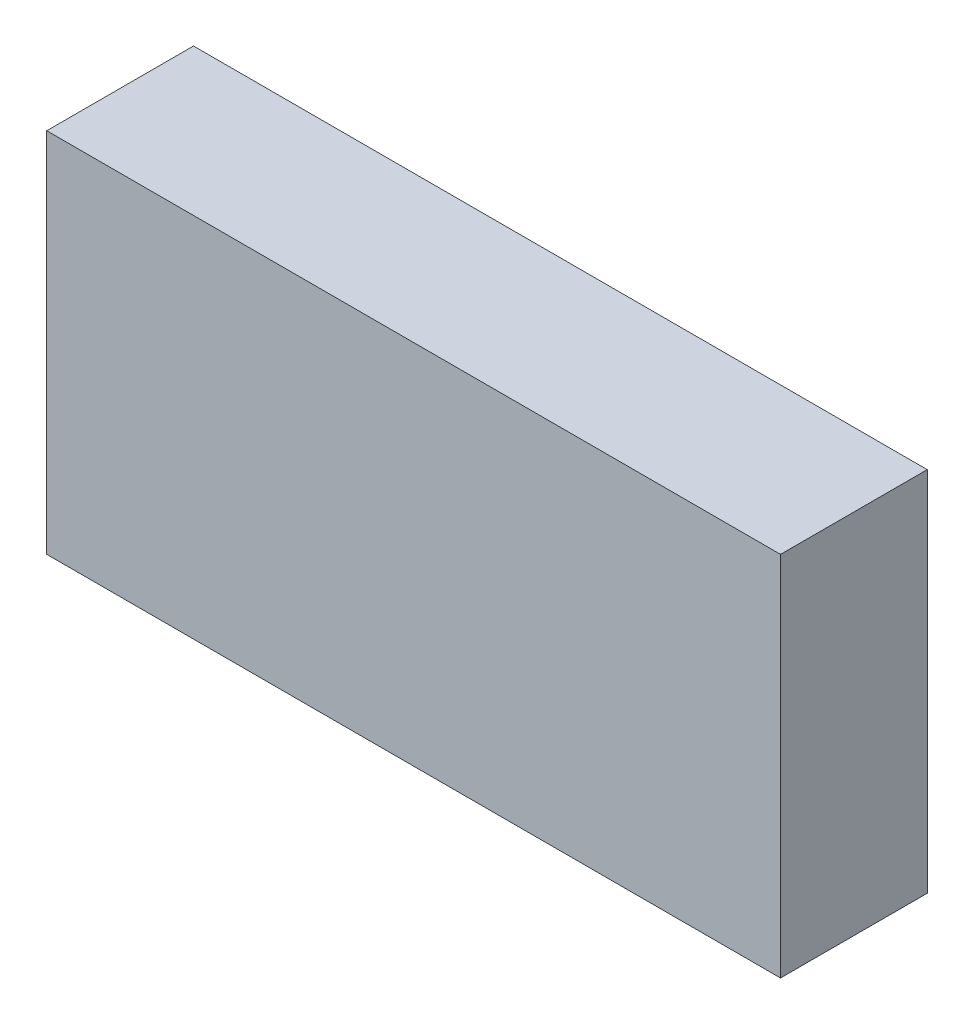
ISO-10303-21;
HEADER;
FILE_DESCRIPTION(('STEP AP214'),'2;1');
FILE_NAME('part.step','',(''),(''),'','','');
FILE_SCHEMA(('AUTOMOTIVE_DESIGN { 1 0 10303 214 1 1 1 1 }'));
ENDSEC;
DATA;
#1=APPLICATION_CONTEXT('core data for automotive mechanical design processes');
#2=APPLICATION_PROTOCOL_DEFINITION('international standard','automotive_design',2000,#1);
#3=PRODUCT_CONTEXT('',#1,'mechanical');
#4=PRODUCT('Part','Part','',(#3));
#5=PRODUCT_RELATED_PRODUCT_CATEGORY('part','',(#4));
#6=PRODUCT_DEFINITION_FORMATION('','',#4);
#7=PRODUCT_DEFINITION_CONTEXT('part definition',#1,'design');
#8=PRODUCT_DEFINITION('design','',#6,#7);
#9=PRODUCT_DEFINITION_SHAPE('','',#8);
#10=(LENGTH_UNIT() NAMED_UNIT(*) SI_UNIT(.MILLI.,.METRE.));
#11=(NAMED_UNIT(*) PLANE_ANGLE_UNIT() SI_UNIT($,.RADIAN.));
#12=(NAMED_UNIT(*) SI_UNIT($,.STERADIAN.) SOLID_ANGLE_UNIT());
#13=UNCERTAINTY_MEASURE_WITH_UNIT(LENGTH_MEASURE(1.E-05),#10,'distance_accuracy_value','');
#14=(GEOMETRIC_REPRESENTATION_CONTEXT(3) GLOBAL_UNCERTAINTY_ASSIGNED_CONTEXT((#13)) GLOBAL_UNIT_ASSIGNED_CONTEXT((#10,
#11,#12)) REPRESENTATION_CONTEXT('',''));
#15=CARTESIAN_POINT('',(0.,0.,0.));
#16=DIRECTION('',(0.,0.,1.));
#17=DIRECTION('',(1.,0.,0.));
#18=AXIS2_PLACEMENT_3D('',#15,#16,#17);
#19=CARTESIAN_POINT('',(300.,30.,-300.));
#20=DIRECTION('',(-1.,0.,0.));
#21=DIRECTION('',(0.,0.,1.));
#22=AXIS2_PLACEMENT_3D('',#19,#20,#21);
#23=PLANE('',#22);
#24=DIRECTION('',(0.,-1.,0.));
#25=VECTOR('',#24,1.);
#26=CARTESIAN_POINT('',(300.,30.,-240.));
#27=LINE('',#26,#25);
#28=CARTESIAN_POINT('',(300.,180.,-240.));
#29=VERTEX_POINT('',#28);
#30=CARTESIAN_POINT('',(300.,30.,-240.));
#31=VERTEX_POINT('',#30);
#32=EDGE_CURVE('E103',#29,#31,#27,.T.);
#33=ORIENTED_EDGE('',*,*,#32,.F.);
#34=DIRECTION('',(0.,0.,1.));
#35=VECTOR('',#34,1.);
#36=CARTESIAN_POINT('',(300.,180.,-300.));
#37=LINE('',#36,#35);
#38=CARTESIAN_POINT('',(300.,180.,-300.));
#39=VERTEX_POINT('',#38);
#40=EDGE_CURVE('E11',#39,#29,#37,.T.);
#41=ORIENTED_EDGE('',*,*,#40,.F.);
#42=DIRECTION('',(0.,-1.,0.));
#43=VECTOR('',#42,1.);
#44=CARTESIAN_POINT('',(300.,30.,-300.));
#45=LINE('',#44,#43);
#46=CARTESIAN_POINT('',(300.,30.,-300.));
#47=VERTEX_POINT('',#46);
#48=EDGE_CURVE('E97',#39,#47,#45,.T.);
#49=ORIENTED_EDGE('',*,*,#48,.T.);
#50=DIRECTION('',(0.,0.,1.));
#51=VECTOR('',#50,1.);
#52=CARTESIAN_POINT('',(300.,30.,-300.));
#53=LINE('',#52,#51);
#54=EDGE_CURVE('E42',#47,#31,#53,.T.);
#55=ORIENTED_EDGE('',*,*,#54,.T.);
#56=EDGE_LOOP('',(#33,#41,#49,#55));
#57=FACE_BOUND('',#56,.T.);
#58=ADVANCED_FACE('F39',(#57),#23,.T.);
#59=CARTESIAN_POINT('',(300.,180.,-300.));
#60=DIRECTION('',(0.,1.,0.));
#61=DIRECTION('',(0.,0.,1.));
#62=AXIS2_PLACEMENT_3D('',#59,#60,#61);
#63=PLANE('',#62);
#64=DIRECTION('',(-1.,0.,0.));
#65=VECTOR('',#64,1.);
#66=CARTESIAN_POINT('',(300.,180.,-240.));
#67=LINE('',#66,#65);
#68=CARTESIAN_POINT('',(600.,180.,-240.));
#69=VERTEX_POINT('',#68);
#70=EDGE_CURVE('E99',#69,#29,#67,.T.);
#71=ORIENTED_EDGE('',*,*,#70,.F.);
#72=DIRECTION('',(0.,0.,1.));
#73=VECTOR('',#72,1.);
#74=CARTESIAN_POINT('',(600.,180.,-300.));
#75=LINE('',#74,#73);
#76=CARTESIAN_POINT('',(600.,180.,-300.));
#77=VERTEX_POINT('',#76);
#78=EDGE_CURVE('E48',#77,#69,#75,.T.);
#79=ORIENTED_EDGE('',*,*,#78,.F.);
#80=DIRECTION('',(-1.,0.,0.));
#81=VECTOR('',#80,1.);
#82=CARTESIAN_POINT('',(300.,180.,-300.));
#83=LINE('',#82,#81);
#84=EDGE_CURVE('E94',#77,#39,#83,.T.);
#85=ORIENTED_EDGE('',*,*,#84,.T.);
#86=ORIENTED_EDGE('',*,*,#40,.T.);
#87=EDGE_LOOP('',(#71,#79,#85,#86));
#88=FACE_BOUND('',#87,.T.);
#89=ADVANCED_FACE('F113',(#88),#63,.T.);
#90=CARTESIAN_POINT('',(600.,30.,-300.));
#91=DIRECTION('',(1.,0.,0.));
#92=DIRECTION('',(0.,0.,-1.));
#93=AXIS2_PLACEMENT_3D('',#90,#91,#92);
#94=PLANE('',#93);
#95=DIRECTION('',(0.,1.,0.));
#96=VECTOR('',#95,1.);
#97=CARTESIAN_POINT('',(600.,30.,-240.));
#98=LINE('',#97,#96);
#99=CARTESIAN_POINT('',(600.,30.,-240.));
#100=VERTEX_POINT('',#99);
#101=EDGE_CURVE('E89',#100,#69,#98,.T.);
#102=ORIENTED_EDGE('',*,*,#101,.F.);
#103=DIRECTION('',(0.,0.,1.));
#104=VECTOR('',#103,1.);
#105=CARTESIAN_POINT('',(600.,30.,-300.));
#106=LINE('',#105,#104);
#107=CARTESIAN_POINT('',(600.,30.,-300.));
#108=VERTEX_POINT('',#107);
#109=EDGE_CURVE('E84',#108,#100,#106,.T.);
#110=ORIENTED_EDGE('',*,*,#109,.F.);
#111=DIRECTION('',(0.,1.,0.));
#112=VECTOR('',#111,1.);
#113=CARTESIAN_POINT('',(600.,30.,-300.));
#114=LINE('',#113,#112);
#115=EDGE_CURVE('E87',#108,#77,#114,.T.);
#116=ORIENTED_EDGE('',*,*,#115,.T.);
#117=ORIENTED_EDGE('',*,*,#78,.T.);
#118=EDGE_LOOP('',(#102,#110,#116,#117));
#119=FACE_BOUND('',#118,.T.);
#120=ADVANCED_FACE('F86',(#119),#94,.T.);
#121=CARTESIAN_POINT('',(300.,30.,-300.));
#122=DIRECTION('',(0.,-1.,0.));
#123=DIRECTION('',(0.,0.,-1.));
#124=AXIS2_PLACEMENT_3D('',#121,#122,#123);
#125=PLANE('',#124);
#126=DIRECTION('',(1.,0.,0.));
#127=VECTOR('',#126,1.);
#128=CARTESIAN_POINT('',(300.,30.,-240.));
#129=LINE('',#128,#127);
#130=EDGE_CURVE('E106',#31,#100,#129,.T.);
#131=ORIENTED_EDGE('',*,*,#130,.F.);
#132=ORIENTED_EDGE('',*,*,#54,.F.);
#133=DIRECTION('',(1.,0.,0.));
#134=VECTOR('',#133,1.);
#135=CARTESIAN_POINT('',(300.,30.,-300.));
#136=LINE('',#135,#134);
#137=EDGE_CURVE('E93',#47,#108,#136,.T.);
#138=ORIENTED_EDGE('',*,*,#137,.T.);
#139=ORIENTED_EDGE('',*,*,#109,.T.);
#140=EDGE_LOOP('',(#131,#132,#138,#139));
#141=FACE_BOUND('',#140,.T.);
#142=ADVANCED_FACE('F96',(#141),#125,.T.);
#143=CARTESIAN_POINT('',(0.,0.,-300.));
#144=DIRECTION('',(0.,0.,-1.));
#145=DIRECTION('',(-1.,0.,0.));
#146=AXIS2_PLACEMENT_3D('',#143,#144,#145);
#147=PLANE('',#146);
#148=ORIENTED_EDGE('',*,*,#48,.F.);
#149=ORIENTED_EDGE('',*,*,#84,.F.);
#150=ORIENTED_EDGE('',*,*,#115,.F.);
#151=ORIENTED_EDGE('',*,*,#137,.F.);
#152=EDGE_LOOP('',(#148,#149,#150,#151));
#153=FACE_BOUND('',#152,.T.);
#154=ADVANCED_FACE('F92',(#153),#147,.T.);
#155=CARTESIAN_POINT('',(0.,0.,-240.));
#156=DIRECTION('',(0.,0.,-1.));
#157=DIRECTION('',(-1.,0.,0.));
#158=AXIS2_PLACEMENT_3D('',#155,#156,#157);
#159=PLANE('',#158);
#160=ORIENTED_EDGE('',*,*,#32,.T.);
#161=ORIENTED_EDGE('',*,*,#130,.T.);
#162=ORIENTED_EDGE('',*,*,#101,.T.);
#163=ORIENTED_EDGE('',*,*,#70,.T.);
#164=EDGE_LOOP('',(#160,#161,#162,#163));
#165=FACE_BOUND('',#164,.T.);
#166=ADVANCED_FACE('F112',(#165),#159,.F.);
#167=CLOSED_SHELL('',(#58,#89,#120,#142,#154,#166));
#168=MANIFOLD_SOLID_BREP('B2',#167);
#169=ADVANCED_BREP_SHAPE_REPRESENTATION('',(#18,#168),#14);
#170=SHAPE_DEFINITION_REPRESENTATION(#9,#169);
ENDSEC;
END-ISO-10303-21;
